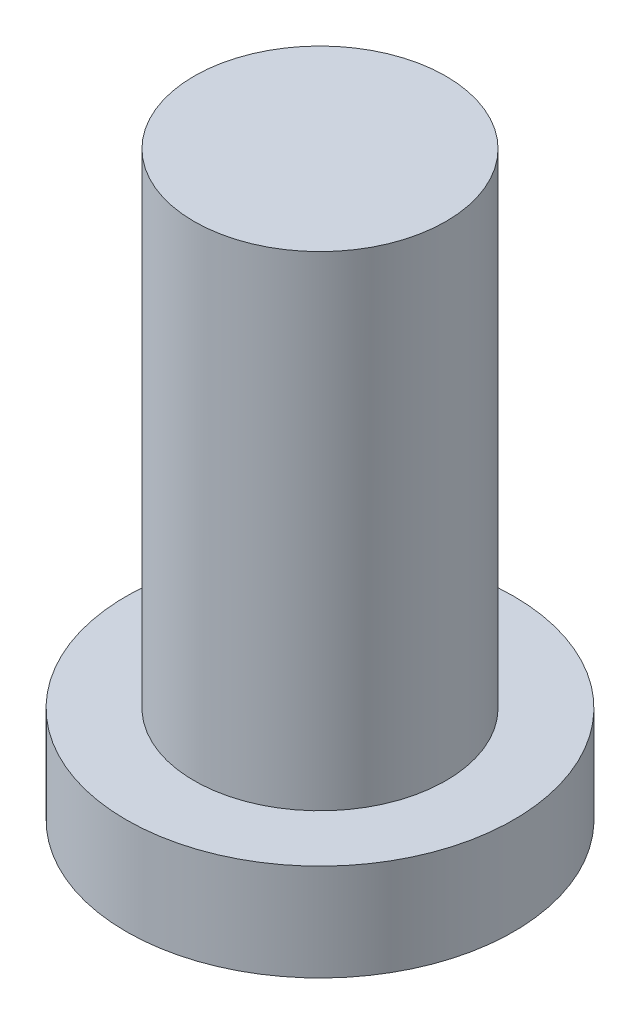
ISO-10303-21;
HEADER;
FILE_DESCRIPTION(('STEP AP214'),'2;1');
FILE_NAME('part.step','',(''),(''),'','','');
FILE_SCHEMA(('AUTOMOTIVE_DESIGN { 1 0 10303 214 1 1 1 1 }'));
ENDSEC;
DATA;
#1=APPLICATION_CONTEXT('core data for automotive mechanical design processes');
#2=APPLICATION_PROTOCOL_DEFINITION('international standard','automotive_design',2000,#1);
#3=PRODUCT_CONTEXT('',#1,'mechanical');
#4=PRODUCT('Part','Part','',(#3));
#5=PRODUCT_RELATED_PRODUCT_CATEGORY('part','',(#4));
#6=PRODUCT_DEFINITION_FORMATION('','',#4);
#7=PRODUCT_DEFINITION_CONTEXT('part definition',#1,'design');
#8=PRODUCT_DEFINITION('design','',#6,#7);
#9=PRODUCT_DEFINITION_SHAPE('','',#8);
#10=(LENGTH_UNIT() NAMED_UNIT(*) SI_UNIT(.MILLI.,.METRE.));
#11=(NAMED_UNIT(*) PLANE_ANGLE_UNIT() SI_UNIT($,.RADIAN.));
#12=(NAMED_UNIT(*) SI_UNIT($,.STERADIAN.) SOLID_ANGLE_UNIT());
#13=UNCERTAINTY_MEASURE_WITH_UNIT(LENGTH_MEASURE(1.E-05),#10,'distance_accuracy_value','');
#14=(GEOMETRIC_REPRESENTATION_CONTEXT(3) GLOBAL_UNCERTAINTY_ASSIGNED_CONTEXT((#13)) GLOBAL_UNIT_ASSIGNED_CONTEXT((#10,
#11,#12)) REPRESENTATION_CONTEXT('',''));
#15=CARTESIAN_POINT('',(0.,0.,0.));
#16=DIRECTION('',(0.,0.,1.));
#17=DIRECTION('',(1.,0.,0.));
#18=AXIS2_PLACEMENT_3D('',#15,#16,#17);
#19=CARTESIAN_POINT('',(0.,5.,0.));
#20=DIRECTION('',(0.,-1.,0.));
#21=DIRECTION('',(0.,0.,-1.));
#22=AXIS2_PLACEMENT_3D('',#19,#20,#21);
#23=CYLINDRICAL_SURFACE('',#22,1.3);
#24=CARTESIAN_POINT('',(0.,5.,0.));
#25=DIRECTION('',(0.,1.,0.));
#26=DIRECTION('',(0.,0.,1.));
#27=AXIS2_PLACEMENT_3D('',#24,#25,#26);
#28=CIRCLE('',#27,1.3);
#29=CARTESIAN_POINT('',(0.,5.,1.3));
#30=VERTEX_POINT('',#29);
#31=EDGE_CURVE('E10',#30,#30,#28,.T.);
#32=ORIENTED_EDGE('',*,*,#31,.F.);
#33=EDGE_LOOP('',(#32));
#34=FACE_BOUND('',#33,.T.);
#35=CARTESIAN_POINT('',(0.,0.,0.));
#36=DIRECTION('',(0.,-1.,0.));
#37=DIRECTION('',(0.,0.,-1.));
#38=AXIS2_PLACEMENT_3D('',#35,#36,#37);
#39=CIRCLE('',#38,1.3);
#40=CARTESIAN_POINT('',(0.,0.,-1.3));
#41=VERTEX_POINT('',#40);
#42=EDGE_CURVE('E37',#41,#41,#39,.T.);
#43=ORIENTED_EDGE('',*,*,#42,.F.);
#44=EDGE_LOOP('',(#43));
#45=FACE_BOUND('',#44,.T.);
#46=ADVANCED_FACE('F31',(#34,#45),#23,.T.);
#47=CARTESIAN_POINT('',(0.,5.,0.));
#48=DIRECTION('',(0.,1.,0.));
#49=DIRECTION('',(0.,0.,1.));
#50=AXIS2_PLACEMENT_3D('',#47,#48,#49);
#51=PLANE('',#50);
#52=ORIENTED_EDGE('',*,*,#31,.T.);
#53=EDGE_LOOP('',(#52));
#54=FACE_BOUND('',#53,.T.);
#55=ADVANCED_FACE('F64',(#54),#51,.T.);
#56=CARTESIAN_POINT('',(0.,-1.,0.));
#57=DIRECTION('',(0.,1.,0.));
#58=DIRECTION('',(0.,0.,1.));
#59=AXIS2_PLACEMENT_3D('',#56,#57,#58);
#60=CYLINDRICAL_SURFACE('',#59,2.);
#61=CARTESIAN_POINT('',(0.,-1.,0.));
#62=DIRECTION('',(0.,-1.,0.));
#63=DIRECTION('',(0.,0.,-1.));
#64=AXIS2_PLACEMENT_3D('',#61,#62,#63);
#65=CIRCLE('',#64,2.);
#66=CARTESIAN_POINT('',(0.,-1.,-2.));
#67=VERTEX_POINT('',#66);
#68=EDGE_CURVE('E41',#67,#67,#65,.T.);
#69=ORIENTED_EDGE('',*,*,#68,.F.);
#70=EDGE_LOOP('',(#69));
#71=FACE_BOUND('',#70,.T.);
#72=CARTESIAN_POINT('',(0.,0.,0.));
#73=DIRECTION('',(0.,-1.,0.));
#74=DIRECTION('',(0.,0.,-1.));
#75=AXIS2_PLACEMENT_3D('',#72,#73,#74);
#76=CIRCLE('',#75,2.);
#77=CARTESIAN_POINT('',(0.,0.,-2.));
#78=VERTEX_POINT('',#77);
#79=EDGE_CURVE('E45',#78,#78,#76,.T.);
#80=ORIENTED_EDGE('',*,*,#79,.T.);
#81=EDGE_LOOP('',(#80));
#82=FACE_BOUND('',#81,.T.);
#83=ADVANCED_FACE('F51',(#71,#82),#60,.T.);
#84=CARTESIAN_POINT('',(0.,-1.,0.));
#85=DIRECTION('',(0.,-1.,0.));
#86=DIRECTION('',(0.,0.,-1.));
#87=AXIS2_PLACEMENT_3D('',#84,#85,#86);
#88=PLANE('',#87);
#89=ORIENTED_EDGE('',*,*,#68,.T.);
#90=EDGE_LOOP('',(#89));
#91=FACE_BOUND('',#90,.T.);
#92=ADVANCED_FACE('F55',(#91),#88,.T.);
#93=CARTESIAN_POINT('',(0.,0.,0.));
#94=DIRECTION('',(0.,-1.,0.));
#95=DIRECTION('',(0.,0.,-1.));
#96=AXIS2_PLACEMENT_3D('',#93,#94,#95);
#97=PLANE('',#96);
#98=ORIENTED_EDGE('',*,*,#42,.T.);
#99=EDGE_LOOP('',(#98));
#100=FACE_BOUND('',#99,.T.);
#101=ORIENTED_EDGE('',*,*,#79,.F.);
#102=EDGE_LOOP('',(#101));
#103=FACE_BOUND('',#102,.T.);
#104=ADVANCED_FACE('F53',(#100,#103),#97,.F.);
#105=CLOSED_SHELL('',(#46,#55,#83,#92,#104));
#106=MANIFOLD_SOLID_BREP('B2',#105);
#107=ADVANCED_BREP_SHAPE_REPRESENTATION('',(#18,#106),#14);
#108=SHAPE_DEFINITION_REPRESENTATION(#9,#107);
ENDSEC;
END-ISO-10303-21;
